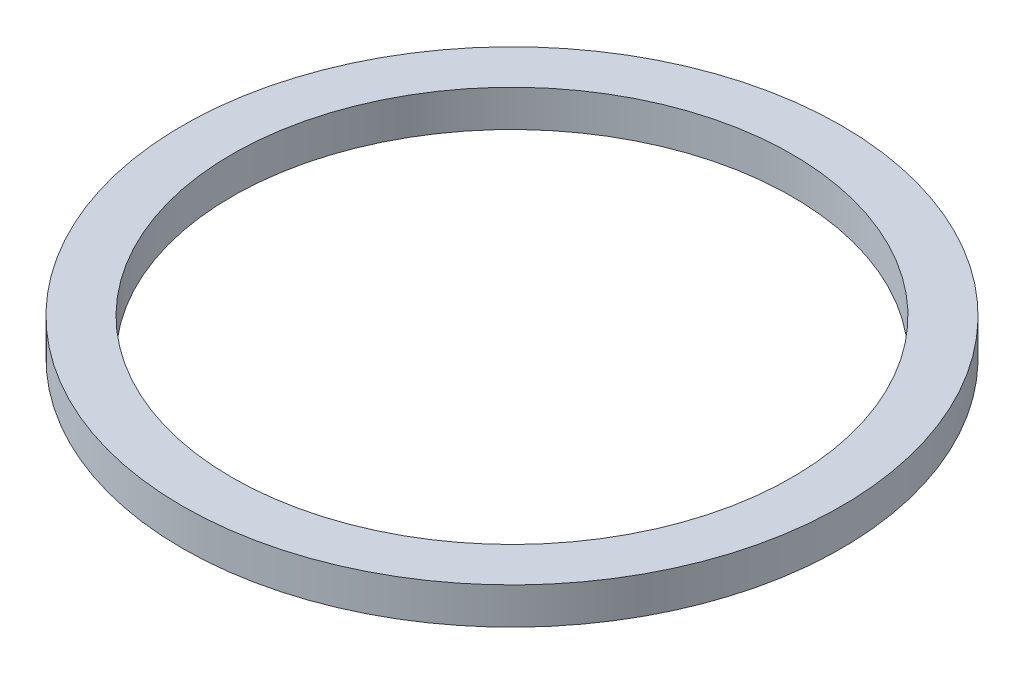
ISO-10303-21;
HEADER;
FILE_DESCRIPTION(('STEP AP214'),'2;1');
FILE_NAME('part.step','',(''),(''),'','','');
FILE_SCHEMA(('AUTOMOTIVE_DESIGN { 1 0 10303 214 1 1 1 1 }'));
ENDSEC;
DATA;
#1=APPLICATION_CONTEXT('core data for automotive mechanical design processes');
#2=APPLICATION_PROTOCOL_DEFINITION('international standard','automotive_design',2000,#1);
#3=PRODUCT_CONTEXT('',#1,'mechanical');
#4=PRODUCT('Part','Part','',(#3));
#5=PRODUCT_RELATED_PRODUCT_CATEGORY('part','',(#4));
#6=PRODUCT_DEFINITION_FORMATION('','',#4);
#7=PRODUCT_DEFINITION_CONTEXT('part definition',#1,'design');
#8=PRODUCT_DEFINITION('design','',#6,#7);
#9=PRODUCT_DEFINITION_SHAPE('','',#8);
#10=(LENGTH_UNIT() NAMED_UNIT(*) SI_UNIT(.MILLI.,.METRE.));
#11=(NAMED_UNIT(*) PLANE_ANGLE_UNIT() SI_UNIT($,.RADIAN.));
#12=(NAMED_UNIT(*) SI_UNIT($,.STERADIAN.) SOLID_ANGLE_UNIT());
#13=UNCERTAINTY_MEASURE_WITH_UNIT(LENGTH_MEASURE(1.E-05),#10,'distance_accuracy_value','');
#14=(GEOMETRIC_REPRESENTATION_CONTEXT(3) GLOBAL_UNCERTAINTY_ASSIGNED_CONTEXT((#13)) GLOBAL_UNIT_ASSIGNED_CONTEXT((#10,
#11,#12)) REPRESENTATION_CONTEXT('',''));
#15=CARTESIAN_POINT('',(0.,0.,0.));
#16=DIRECTION('',(0.,0.,1.));
#17=DIRECTION('',(1.,0.,0.));
#18=AXIS2_PLACEMENT_3D('',#15,#16,#17);
#19=CARTESIAN_POINT('',(0.,1.7,0.));
#20=DIRECTION('',(0.,1.,0.));
#21=DIRECTION('',(0.,0.,1.));
#22=AXIS2_PLACEMENT_3D('',#19,#20,#21);
#23=PLANE('',#22);
#24=CARTESIAN_POINT('',(0.,1.7,0.));
#25=DIRECTION('',(0.,1.,0.));
#26=DIRECTION('',(0.,0.,1.));
#27=AXIS2_PLACEMENT_3D('',#24,#25,#26);
#28=CIRCLE('',#27,15.3);
#29=CARTESIAN_POINT('',(0.,1.7,15.3));
#30=VERTEX_POINT('',#29);
#31=EDGE_CURVE('E12',#30,#30,#28,.T.);
#32=ORIENTED_EDGE('',*,*,#31,.T.);
#33=EDGE_LOOP('',(#32));
#34=FACE_BOUND('',#33,.T.);
#35=CARTESIAN_POINT('',(0.,1.7,0.));
#36=DIRECTION('',(0.,1.,0.));
#37=DIRECTION('',(0.,0.,1.));
#38=AXIS2_PLACEMENT_3D('',#35,#36,#37);
#39=CIRCLE('',#38,13.);
#40=CARTESIAN_POINT('',(0.,1.7,13.));
#41=VERTEX_POINT('',#40);
#42=EDGE_CURVE('E54',#41,#41,#39,.T.);
#43=ORIENTED_EDGE('',*,*,#42,.F.);
#44=EDGE_LOOP('',(#43));
#45=FACE_BOUND('',#44,.T.);
#46=ADVANCED_FACE('F43',(#34,#45),#23,.T.);
#47=CARTESIAN_POINT('',(0.,0.,0.));
#48=DIRECTION('',(0.,1.,0.));
#49=DIRECTION('',(0.,0.,1.));
#50=AXIS2_PLACEMENT_3D('',#47,#48,#49);
#51=PLANE('',#50);
#52=CARTESIAN_POINT('',(0.,0.,0.));
#53=DIRECTION('',(0.,1.,0.));
#54=DIRECTION('',(0.,0.,1.));
#55=AXIS2_PLACEMENT_3D('',#52,#53,#54);
#56=CIRCLE('',#55,15.3);
#57=CARTESIAN_POINT('',(0.,0.,15.3));
#58=VERTEX_POINT('',#57);
#59=EDGE_CURVE('E47',#58,#58,#56,.T.);
#60=ORIENTED_EDGE('',*,*,#59,.F.);
#61=EDGE_LOOP('',(#60));
#62=FACE_BOUND('',#61,.T.);
#63=CARTESIAN_POINT('',(0.,0.,0.));
#64=DIRECTION('',(0.,1.,0.));
#65=DIRECTION('',(0.,0.,1.));
#66=AXIS2_PLACEMENT_3D('',#63,#64,#65);
#67=CIRCLE('',#66,13.);
#68=CARTESIAN_POINT('',(0.,0.,13.));
#69=VERTEX_POINT('',#68);
#70=EDGE_CURVE('E56',#69,#69,#67,.T.);
#71=ORIENTED_EDGE('',*,*,#70,.T.);
#72=EDGE_LOOP('',(#71));
#73=FACE_BOUND('',#72,.T.);
#74=ADVANCED_FACE('F66',(#62,#73),#51,.F.);
#75=CARTESIAN_POINT('',(0.,1.7,0.));
#76=DIRECTION('',(0.,-1.,0.));
#77=DIRECTION('',(0.,0.,-1.));
#78=AXIS2_PLACEMENT_3D('',#75,#76,#77);
#79=CYLINDRICAL_SURFACE('',#78,15.3);
#80=ORIENTED_EDGE('',*,*,#31,.F.);
#81=EDGE_LOOP('',(#80));
#82=FACE_BOUND('',#81,.T.);
#83=ORIENTED_EDGE('',*,*,#59,.T.);
#84=EDGE_LOOP('',(#83));
#85=FACE_BOUND('',#84,.T.);
#86=ADVANCED_FACE('F45',(#82,#85),#79,.T.);
#87=CARTESIAN_POINT('',(0.,1.7,0.));
#88=DIRECTION('',(0.,-1.,0.));
#89=DIRECTION('',(0.,0.,-1.));
#90=AXIS2_PLACEMENT_3D('',#87,#88,#89);
#91=CYLINDRICAL_SURFACE('',#90,13.);
#92=ORIENTED_EDGE('',*,*,#42,.T.);
#93=EDGE_LOOP('',(#92));
#94=FACE_BOUND('',#93,.T.);
#95=ORIENTED_EDGE('',*,*,#70,.F.);
#96=EDGE_LOOP('',(#95));
#97=FACE_BOUND('',#96,.T.);
#98=ADVANCED_FACE('F62',(#94,#97),#91,.F.);
#99=CLOSED_SHELL('',(#46,#74,#86,#98));
#100=MANIFOLD_SOLID_BREP('B2',#99);
#101=ADVANCED_BREP_SHAPE_REPRESENTATION('',(#18,#100),#14);
#102=SHAPE_DEFINITION_REPRESENTATION(#9,#101);
ENDSEC;
END-ISO-10303-21;
